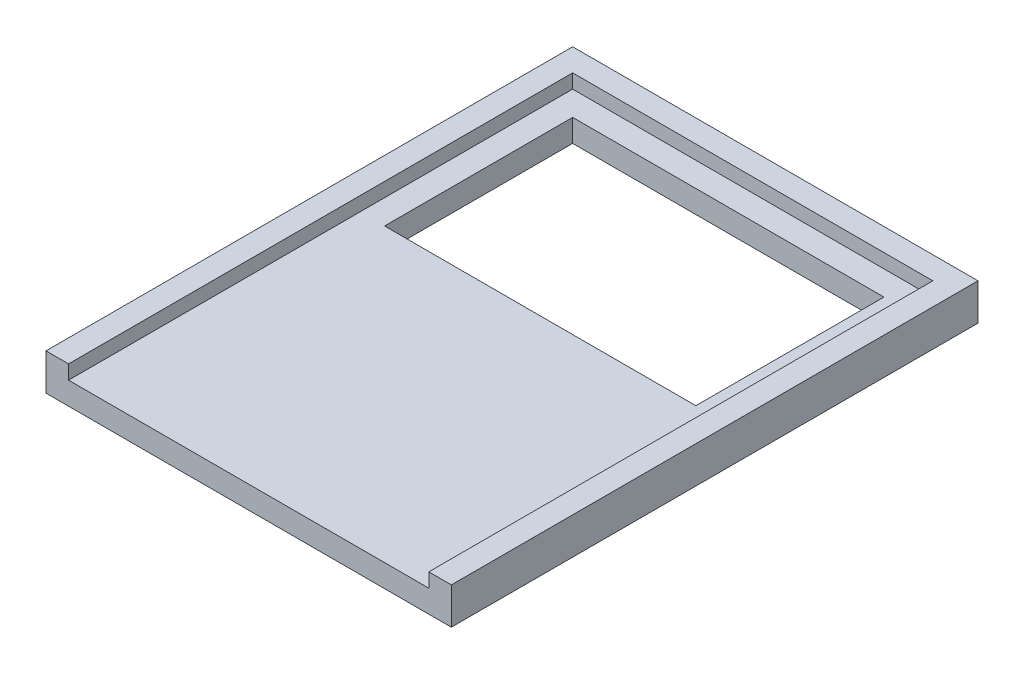
ISO-10303-21;
HEADER;
FILE_DESCRIPTION(('STEP AP214'),'2;1');
FILE_NAME('part.step','',(''),(''),'','','');
FILE_SCHEMA(('AUTOMOTIVE_DESIGN { 1 0 10303 214 1 1 1 1 }'));
ENDSEC;
DATA;
#1=APPLICATION_CONTEXT('core data for automotive mechanical design processes');
#2=APPLICATION_PROTOCOL_DEFINITION('international standard','automotive_design',2000,#1);
#3=PRODUCT_CONTEXT('',#1,'mechanical');
#4=PRODUCT('Part','Part','',(#3));
#5=PRODUCT_RELATED_PRODUCT_CATEGORY('part','',(#4));
#6=PRODUCT_DEFINITION_FORMATION('','',#4);
#7=PRODUCT_DEFINITION_CONTEXT('part definition',#1,'design');
#8=PRODUCT_DEFINITION('design','',#6,#7);
#9=PRODUCT_DEFINITION_SHAPE('','',#8);
#10=(LENGTH_UNIT() NAMED_UNIT(*) SI_UNIT(.MILLI.,.METRE.));
#11=(NAMED_UNIT(*) PLANE_ANGLE_UNIT() SI_UNIT($,.RADIAN.));
#12=(NAMED_UNIT(*) SI_UNIT($,.STERADIAN.) SOLID_ANGLE_UNIT());
#13=UNCERTAINTY_MEASURE_WITH_UNIT(LENGTH_MEASURE(1.E-05),#10,'distance_accuracy_value','');
#14=(GEOMETRIC_REPRESENTATION_CONTEXT(3) GLOBAL_UNCERTAINTY_ASSIGNED_CONTEXT((#13)) GLOBAL_UNIT_ASSIGNED_CONTEXT((#10,
#11,#12)) REPRESENTATION_CONTEXT('',''));
#15=CARTESIAN_POINT('',(0.,0.,0.));
#16=DIRECTION('',(0.,0.,1.));
#17=DIRECTION('',(1.,0.,0.));
#18=AXIS2_PLACEMENT_3D('',#15,#16,#17);
#19=CARTESIAN_POINT('',(0.,24.,0.));
#20=DIRECTION('',(0.,1.,0.));
#21=DIRECTION('',(0.,0.,1.));
#22=AXIS2_PLACEMENT_3D('',#19,#20,#21);
#23=PLANE('',#22);
#24=DIRECTION('',(0.,0.,1.));
#25=VECTOR('',#24,1.);
#26=CARTESIAN_POINT('',(191.5,24.,280.));
#27=LINE('',#26,#25);
#28=CARTESIAN_POINT('',(191.5,24.,-256.));
#29=VERTEX_POINT('',#28);
#30=CARTESIAN_POINT('',(191.5,24.,280.));
#31=VERTEX_POINT('',#30);
#32=EDGE_CURVE('E50',#29,#31,#27,.T.);
#33=ORIENTED_EDGE('',*,*,#32,.F.);
#34=DIRECTION('',(1.,0.,0.));
#35=VECTOR('',#34,1.);
#36=CARTESIAN_POINT('',(191.5,24.,-256.));
#37=LINE('',#36,#35);
#38=CARTESIAN_POINT('',(-191.5,24.,-256.));
#39=VERTEX_POINT('',#38);
#40=EDGE_CURVE('E144',#39,#29,#37,.T.);
#41=ORIENTED_EDGE('',*,*,#40,.F.);
#42=DIRECTION('',(0.,0.,-1.));
#43=VECTOR('',#42,1.);
#44=CARTESIAN_POINT('',(-191.5,24.,-256.));
#45=LINE('',#44,#43);
#46=CARTESIAN_POINT('',(-191.5,24.,280.));
#47=VERTEX_POINT('',#46);
#48=EDGE_CURVE('E160',#47,#39,#45,.T.);
#49=ORIENTED_EDGE('',*,*,#48,.F.);
#50=DIRECTION('',(1.,0.,0.));
#51=VECTOR('',#50,1.);
#52=CARTESIAN_POINT('',(-215.5,24.,280.));
#53=LINE('',#52,#51);
#54=EDGE_CURVE('E55',#47,#31,#53,.T.);
#55=ORIENTED_EDGE('',*,*,#54,.T.);
#56=EDGE_LOOP('',(#33,#41,#49,#55));
#57=FACE_BOUND('',#56,.T.);
#58=DIRECTION('',(1.,0.,0.));
#59=VECTOR('',#58,1.);
#60=CARTESIAN_POINT('',(-165.5,24.,-30.));
#61=LINE('',#60,#59);
#62=CARTESIAN_POINT('',(-165.5,24.,-30.));
#63=VERTEX_POINT('',#62);
#64=CARTESIAN_POINT('',(165.5,24.,-30.));
#65=VERTEX_POINT('',#64);
#66=EDGE_CURVE('E184',#63,#65,#61,.T.);
#67=ORIENTED_EDGE('',*,*,#66,.F.);
#68=DIRECTION('',(0.,0.,1.));
#69=VECTOR('',#68,1.);
#70=CARTESIAN_POINT('',(-165.5,24.,-230.));
#71=LINE('',#70,#69);
#72=CARTESIAN_POINT('',(-165.5,24.,-230.));
#73=VERTEX_POINT('',#72);
#74=EDGE_CURVE('E182',#73,#63,#71,.T.);
#75=ORIENTED_EDGE('',*,*,#74,.F.);
#76=DIRECTION('',(-1.,0.,0.));
#77=VECTOR('',#76,1.);
#78=CARTESIAN_POINT('',(-165.5,24.,-230.));
#79=LINE('',#78,#77);
#80=CARTESIAN_POINT('',(165.5,24.,-230.));
#81=VERTEX_POINT('',#80);
#82=EDGE_CURVE('E190',#81,#73,#79,.T.);
#83=ORIENTED_EDGE('',*,*,#82,.F.);
#84=DIRECTION('',(0.,0.,-1.));
#85=VECTOR('',#84,1.);
#86=CARTESIAN_POINT('',(165.5,24.,-230.));
#87=LINE('',#86,#85);
#88=EDGE_CURVE('E187',#65,#81,#87,.T.);
#89=ORIENTED_EDGE('',*,*,#88,.F.);
#90=EDGE_LOOP('',(#67,#75,#83,#89));
#91=FACE_BOUND('',#90,.T.);
#92=ADVANCED_FACE('F33',(#57,#91),#23,.T.);
#93=CARTESIAN_POINT('',(0.,0.,0.));
#94=DIRECTION('',(0.,1.,0.));
#95=DIRECTION('',(0.,0.,1.));
#96=AXIS2_PLACEMENT_3D('',#93,#94,#95);
#97=PLANE('',#96);
#98=DIRECTION('',(0.,0.,1.));
#99=VECTOR('',#98,1.);
#100=CARTESIAN_POINT('',(-215.5,0.,-280.));
#101=LINE('',#100,#99);
#102=CARTESIAN_POINT('',(-215.5,0.,-280.));
#103=VERTEX_POINT('',#102);
#104=CARTESIAN_POINT('',(-215.5,0.,280.));
#105=VERTEX_POINT('',#104);
#106=EDGE_CURVE('E127',#103,#105,#101,.T.);
#107=ORIENTED_EDGE('',*,*,#106,.F.);
#108=DIRECTION('',(-1.,0.,0.));
#109=VECTOR('',#108,1.);
#110=CARTESIAN_POINT('',(-215.5,0.,-280.));
#111=LINE('',#110,#109);
#112=CARTESIAN_POINT('',(215.5,0.,-280.));
#113=VERTEX_POINT('',#112);
#114=EDGE_CURVE('E218',#113,#103,#111,.T.);
#115=ORIENTED_EDGE('',*,*,#114,.F.);
#116=DIRECTION('',(0.,0.,-1.));
#117=VECTOR('',#116,1.);
#118=CARTESIAN_POINT('',(215.5,0.,-280.));
#119=LINE('',#118,#117);
#120=CARTESIAN_POINT('',(215.5,0.,280.));
#121=VERTEX_POINT('',#120);
#122=EDGE_CURVE('E235',#121,#113,#119,.T.);
#123=ORIENTED_EDGE('',*,*,#122,.F.);
#124=DIRECTION('',(1.,0.,0.));
#125=VECTOR('',#124,1.);
#126=CARTESIAN_POINT('',(-215.5,0.,280.));
#127=LINE('',#126,#125);
#128=EDGE_CURVE('E242',#105,#121,#127,.T.);
#129=ORIENTED_EDGE('',*,*,#128,.F.);
#130=EDGE_LOOP('',(#107,#115,#123,#129));
#131=FACE_BOUND('',#130,.T.);
#132=DIRECTION('',(0.,0.,1.));
#133=VECTOR('',#132,1.);
#134=CARTESIAN_POINT('',(-165.5,0.,-230.));
#135=LINE('',#134,#133);
#136=CARTESIAN_POINT('',(-165.5,0.,-230.));
#137=VERTEX_POINT('',#136);
#138=CARTESIAN_POINT('',(-165.5,0.,-30.));
#139=VERTEX_POINT('',#138);
#140=EDGE_CURVE('E180',#137,#139,#135,.T.);
#141=ORIENTED_EDGE('',*,*,#140,.T.);
#142=DIRECTION('',(1.,0.,0.));
#143=VECTOR('',#142,1.);
#144=CARTESIAN_POINT('',(-165.5,0.,-30.));
#145=LINE('',#144,#143);
#146=CARTESIAN_POINT('',(165.5,0.,-30.));
#147=VERTEX_POINT('',#146);
#148=EDGE_CURVE('E195',#139,#147,#145,.T.);
#149=ORIENTED_EDGE('',*,*,#148,.T.);
#150=DIRECTION('',(0.,0.,-1.));
#151=VECTOR('',#150,1.);
#152=CARTESIAN_POINT('',(165.5,0.,-230.));
#153=LINE('',#152,#151);
#154=CARTESIAN_POINT('',(165.5,0.,-230.));
#155=VERTEX_POINT('',#154);
#156=EDGE_CURVE('E198',#147,#155,#153,.T.);
#157=ORIENTED_EDGE('',*,*,#156,.T.);
#158=DIRECTION('',(-1.,0.,0.));
#159=VECTOR('',#158,1.);
#160=CARTESIAN_POINT('',(-165.5,0.,-230.));
#161=LINE('',#160,#159);
#162=EDGE_CURVE('E185',#155,#137,#161,.T.);
#163=ORIENTED_EDGE('',*,*,#162,.T.);
#164=EDGE_LOOP('',(#141,#149,#157,#163));
#165=FACE_BOUND('',#164,.T.);
#166=ADVANCED_FACE('F244',(#131,#165),#97,.F.);
#167=CARTESIAN_POINT('',(-215.5,24.,-280.));
#168=DIRECTION('',(1.,0.,0.));
#169=DIRECTION('',(0.,0.,-1.));
#170=AXIS2_PLACEMENT_3D('',#167,#168,#169);
#171=PLANE('',#170);
#172=ORIENTED_EDGE('',*,*,#106,.T.);
#173=DIRECTION('',(0.,-1.,0.));
#174=VECTOR('',#173,1.);
#175=CARTESIAN_POINT('',(-215.5,24.,280.));
#176=LINE('',#175,#174);
#177=CARTESIAN_POINT('',(-215.5,39.,280.));
#178=VERTEX_POINT('',#177);
#179=EDGE_CURVE('E11',#178,#105,#176,.T.);
#180=ORIENTED_EDGE('',*,*,#179,.F.);
#181=DIRECTION('',(0.,0.,1.));
#182=VECTOR('',#181,1.);
#183=CARTESIAN_POINT('',(-215.5,39.,280.));
#184=LINE('',#183,#182);
#185=CARTESIAN_POINT('',(-215.5,39.,-280.));
#186=VERTEX_POINT('',#185);
#187=EDGE_CURVE('E125',#186,#178,#184,.T.);
#188=ORIENTED_EDGE('',*,*,#187,.F.);
#189=DIRECTION('',(0.,-1.,0.));
#190=VECTOR('',#189,1.);
#191=CARTESIAN_POINT('',(-215.5,24.,-280.));
#192=LINE('',#191,#190);
#193=EDGE_CURVE('E217',#186,#103,#192,.T.);
#194=ORIENTED_EDGE('',*,*,#193,.T.);
#195=EDGE_LOOP('',(#172,#180,#188,#194));
#196=FACE_BOUND('',#195,.T.);
#197=ADVANCED_FACE('F35',(#196),#171,.F.);
#198=CARTESIAN_POINT('',(-215.5,24.,280.));
#199=DIRECTION('',(0.,0.,-1.));
#200=DIRECTION('',(-1.,0.,0.));
#201=AXIS2_PLACEMENT_3D('',#198,#199,#200);
#202=PLANE('',#201);
#203=ORIENTED_EDGE('',*,*,#128,.T.);
#204=DIRECTION('',(0.,-1.,0.));
#205=VECTOR('',#204,1.);
#206=CARTESIAN_POINT('',(215.5,24.,280.));
#207=LINE('',#206,#205);
#208=CARTESIAN_POINT('',(215.5,39.,280.));
#209=VERTEX_POINT('',#208);
#210=EDGE_CURVE('E42',#209,#121,#207,.T.);
#211=ORIENTED_EDGE('',*,*,#210,.F.);
#212=DIRECTION('',(1.,0.,0.));
#213=VECTOR('',#212,1.);
#214=CARTESIAN_POINT('',(215.5,39.,280.));
#215=LINE('',#214,#213);
#216=CARTESIAN_POINT('',(191.5,39.,280.));
#217=VERTEX_POINT('',#216);
#218=EDGE_CURVE('E152',#217,#209,#215,.T.);
#219=ORIENTED_EDGE('',*,*,#218,.F.);
#220=DIRECTION('',(0.,-1.,0.));
#221=VECTOR('',#220,1.);
#222=CARTESIAN_POINT('',(191.5,39.,280.));
#223=LINE('',#222,#221);
#224=EDGE_CURVE('E158',#217,#31,#223,.T.);
#225=ORIENTED_EDGE('',*,*,#224,.T.);
#226=ORIENTED_EDGE('',*,*,#54,.F.);
#227=DIRECTION('',(0.,-1.,0.));
#228=VECTOR('',#227,1.);
#229=CARTESIAN_POINT('',(-191.5,39.,280.));
#230=LINE('',#229,#228);
#231=CARTESIAN_POINT('',(-191.5,39.,280.));
#232=VERTEX_POINT('',#231);
#233=EDGE_CURVE('E133',#232,#47,#230,.T.);
#234=ORIENTED_EDGE('',*,*,#233,.F.);
#235=DIRECTION('',(1.,0.,0.));
#236=VECTOR('',#235,1.);
#237=CARTESIAN_POINT('',(-191.5,39.,280.));
#238=LINE('',#237,#236);
#239=EDGE_CURVE('E130',#178,#232,#238,.T.);
#240=ORIENTED_EDGE('',*,*,#239,.F.);
#241=ORIENTED_EDGE('',*,*,#179,.T.);
#242=EDGE_LOOP('',(#203,#211,#219,#225,#226,#234,#240,#241));
#243=FACE_BOUND('',#242,.T.);
#244=ADVANCED_FACE('F131',(#243),#202,.F.);
#245=CARTESIAN_POINT('',(215.5,24.,-280.));
#246=DIRECTION('',(-1.,0.,0.));
#247=DIRECTION('',(0.,0.,1.));
#248=AXIS2_PLACEMENT_3D('',#245,#246,#247);
#249=PLANE('',#248);
#250=ORIENTED_EDGE('',*,*,#122,.T.);
#251=DIRECTION('',(0.,-1.,0.));
#252=VECTOR('',#251,1.);
#253=CARTESIAN_POINT('',(215.5,24.,-280.));
#254=LINE('',#253,#252);
#255=CARTESIAN_POINT('',(215.5,39.,-280.));
#256=VERTEX_POINT('',#255);
#257=EDGE_CURVE('E234',#256,#113,#254,.T.);
#258=ORIENTED_EDGE('',*,*,#257,.F.);
#259=DIRECTION('',(0.,0.,-1.));
#260=VECTOR('',#259,1.);
#261=CARTESIAN_POINT('',(215.5,39.,-280.));
#262=LINE('',#261,#260);
#263=EDGE_CURVE('E155',#209,#256,#262,.T.);
#264=ORIENTED_EDGE('',*,*,#263,.F.);
#265=ORIENTED_EDGE('',*,*,#210,.T.);
#266=EDGE_LOOP('',(#250,#258,#264,#265));
#267=FACE_BOUND('',#266,.T.);
#268=ADVANCED_FACE('F231',(#267),#249,.F.);
#269=CARTESIAN_POINT('',(-215.5,24.,-280.));
#270=DIRECTION('',(0.,0.,1.));
#271=DIRECTION('',(1.,0.,0.));
#272=AXIS2_PLACEMENT_3D('',#269,#270,#271);
#273=PLANE('',#272);
#274=ORIENTED_EDGE('',*,*,#114,.T.);
#275=ORIENTED_EDGE('',*,*,#193,.F.);
#276=DIRECTION('',(-1.,0.,0.));
#277=VECTOR('',#276,1.);
#278=CARTESIAN_POINT('',(-215.5,39.,-280.));
#279=LINE('',#278,#277);
#280=EDGE_CURVE('E142',#256,#186,#279,.T.);
#281=ORIENTED_EDGE('',*,*,#280,.F.);
#282=ORIENTED_EDGE('',*,*,#257,.T.);
#283=EDGE_LOOP('',(#274,#275,#281,#282));
#284=FACE_BOUND('',#283,.T.);
#285=ADVANCED_FACE('F246',(#284),#273,.F.);
#286=CARTESIAN_POINT('',(-165.5,24.,-230.));
#287=DIRECTION('',(1.,0.,0.));
#288=DIRECTION('',(0.,0.,-1.));
#289=AXIS2_PLACEMENT_3D('',#286,#287,#288);
#290=PLANE('',#289);
#291=ORIENTED_EDGE('',*,*,#140,.F.);
#292=DIRECTION('',(0.,-1.,0.));
#293=VECTOR('',#292,1.);
#294=CARTESIAN_POINT('',(-165.5,24.,-230.));
#295=LINE('',#294,#293);
#296=EDGE_CURVE('E192',#73,#137,#295,.T.);
#297=ORIENTED_EDGE('',*,*,#296,.F.);
#298=ORIENTED_EDGE('',*,*,#74,.T.);
#299=DIRECTION('',(0.,-1.,0.));
#300=VECTOR('',#299,1.);
#301=CARTESIAN_POINT('',(-165.5,24.,-30.));
#302=LINE('',#301,#300);
#303=EDGE_CURVE('E209',#63,#139,#302,.T.);
#304=ORIENTED_EDGE('',*,*,#303,.T.);
#305=EDGE_LOOP('',(#291,#297,#298,#304));
#306=FACE_BOUND('',#305,.T.);
#307=ADVANCED_FACE('F248',(#306),#290,.T.);
#308=CARTESIAN_POINT('',(-165.5,24.,-30.));
#309=DIRECTION('',(0.,0.,-1.));
#310=DIRECTION('',(-1.,0.,0.));
#311=AXIS2_PLACEMENT_3D('',#308,#309,#310);
#312=PLANE('',#311);
#313=ORIENTED_EDGE('',*,*,#148,.F.);
#314=ORIENTED_EDGE('',*,*,#303,.F.);
#315=ORIENTED_EDGE('',*,*,#66,.T.);
#316=DIRECTION('',(0.,-1.,0.));
#317=VECTOR('',#316,1.);
#318=CARTESIAN_POINT('',(165.5,24.,-30.));
#319=LINE('',#318,#317);
#320=EDGE_CURVE('E207',#65,#147,#319,.T.);
#321=ORIENTED_EDGE('',*,*,#320,.T.);
#322=EDGE_LOOP('',(#313,#314,#315,#321));
#323=FACE_BOUND('',#322,.T.);
#324=ADVANCED_FACE('F254',(#323),#312,.T.);
#325=CARTESIAN_POINT('',(165.5,24.,-230.));
#326=DIRECTION('',(-1.,0.,0.));
#327=DIRECTION('',(0.,0.,1.));
#328=AXIS2_PLACEMENT_3D('',#325,#326,#327);
#329=PLANE('',#328);
#330=ORIENTED_EDGE('',*,*,#156,.F.);
#331=ORIENTED_EDGE('',*,*,#320,.F.);
#332=ORIENTED_EDGE('',*,*,#88,.T.);
#333=DIRECTION('',(0.,-1.,0.));
#334=VECTOR('',#333,1.);
#335=CARTESIAN_POINT('',(165.5,24.,-230.));
#336=LINE('',#335,#334);
#337=EDGE_CURVE('E205',#81,#155,#336,.T.);
#338=ORIENTED_EDGE('',*,*,#337,.T.);
#339=EDGE_LOOP('',(#330,#331,#332,#338));
#340=FACE_BOUND('',#339,.T.);
#341=ADVANCED_FACE('F267',(#340),#329,.T.);
#342=CARTESIAN_POINT('',(-165.5,24.,-230.));
#343=DIRECTION('',(0.,0.,1.));
#344=DIRECTION('',(1.,0.,0.));
#345=AXIS2_PLACEMENT_3D('',#342,#343,#344);
#346=PLANE('',#345);
#347=ORIENTED_EDGE('',*,*,#162,.F.);
#348=ORIENTED_EDGE('',*,*,#337,.F.);
#349=ORIENTED_EDGE('',*,*,#82,.T.);
#350=ORIENTED_EDGE('',*,*,#296,.T.);
#351=EDGE_LOOP('',(#347,#348,#349,#350));
#352=FACE_BOUND('',#351,.T.);
#353=ADVANCED_FACE('F271',(#352),#346,.T.);
#354=CARTESIAN_POINT('',(-191.5,39.,-256.));
#355=DIRECTION('',(-1.,0.,0.));
#356=DIRECTION('',(0.,0.,1.));
#357=AXIS2_PLACEMENT_3D('',#354,#355,#356);
#358=PLANE('',#357);
#359=ORIENTED_EDGE('',*,*,#48,.T.);
#360=DIRECTION('',(0.,-1.,0.));
#361=VECTOR('',#360,1.);
#362=CARTESIAN_POINT('',(-191.5,39.,-256.));
#363=LINE('',#362,#361);
#364=CARTESIAN_POINT('',(-191.5,39.,-256.));
#365=VERTEX_POINT('',#364);
#366=EDGE_CURVE('E172',#365,#39,#363,.T.);
#367=ORIENTED_EDGE('',*,*,#366,.F.);
#368=DIRECTION('',(0.,0.,-1.));
#369=VECTOR('',#368,1.);
#370=CARTESIAN_POINT('',(-191.5,39.,-256.));
#371=LINE('',#370,#369);
#372=EDGE_CURVE('E136',#232,#365,#371,.T.);
#373=ORIENTED_EDGE('',*,*,#372,.F.);
#374=ORIENTED_EDGE('',*,*,#233,.T.);
#375=EDGE_LOOP('',(#359,#367,#373,#374));
#376=FACE_BOUND('',#375,.T.);
#377=ADVANCED_FACE('F224',(#376),#358,.F.);
#378=CARTESIAN_POINT('',(191.5,39.,-256.));
#379=DIRECTION('',(0.,0.,-1.));
#380=DIRECTION('',(-1.,0.,0.));
#381=AXIS2_PLACEMENT_3D('',#378,#379,#380);
#382=PLANE('',#381);
#383=ORIENTED_EDGE('',*,*,#40,.T.);
#384=DIRECTION('',(0.,-1.,0.));
#385=VECTOR('',#384,1.);
#386=CARTESIAN_POINT('',(191.5,39.,-256.));
#387=LINE('',#386,#385);
#388=CARTESIAN_POINT('',(191.5,39.,-256.));
#389=VERTEX_POINT('',#388);
#390=EDGE_CURVE('E163',#389,#29,#387,.T.);
#391=ORIENTED_EDGE('',*,*,#390,.F.);
#392=DIRECTION('',(1.,0.,0.));
#393=VECTOR('',#392,1.);
#394=CARTESIAN_POINT('',(191.5,39.,-256.));
#395=LINE('',#394,#393);
#396=EDGE_CURVE('E148',#365,#389,#395,.T.);
#397=ORIENTED_EDGE('',*,*,#396,.F.);
#398=ORIENTED_EDGE('',*,*,#366,.T.);
#399=EDGE_LOOP('',(#383,#391,#397,#398));
#400=FACE_BOUND('',#399,.T.);
#401=ADVANCED_FACE('F226',(#400),#382,.F.);
#402=CARTESIAN_POINT('',(191.5,39.,280.));
#403=DIRECTION('',(1.,0.,0.));
#404=DIRECTION('',(0.,0.,-1.));
#405=AXIS2_PLACEMENT_3D('',#402,#403,#404);
#406=PLANE('',#405);
#407=ORIENTED_EDGE('',*,*,#32,.T.);
#408=ORIENTED_EDGE('',*,*,#224,.F.);
#409=DIRECTION('',(0.,0.,1.));
#410=VECTOR('',#409,1.);
#411=CARTESIAN_POINT('',(191.5,39.,280.));
#412=LINE('',#411,#410);
#413=EDGE_CURVE('E150',#389,#217,#412,.T.);
#414=ORIENTED_EDGE('',*,*,#413,.F.);
#415=ORIENTED_EDGE('',*,*,#390,.T.);
#416=EDGE_LOOP('',(#407,#408,#414,#415));
#417=FACE_BOUND('',#416,.T.);
#418=ADVANCED_FACE('F227',(#417),#406,.F.);
#419=CARTESIAN_POINT('',(0.,39.,0.));
#420=DIRECTION('',(0.,-1.,0.));
#421=DIRECTION('',(0.,0.,-1.));
#422=AXIS2_PLACEMENT_3D('',#419,#420,#421);
#423=PLANE('',#422);
#424=ORIENTED_EDGE('',*,*,#187,.T.);
#425=ORIENTED_EDGE('',*,*,#239,.T.);
#426=ORIENTED_EDGE('',*,*,#372,.T.);
#427=ORIENTED_EDGE('',*,*,#396,.T.);
#428=ORIENTED_EDGE('',*,*,#413,.T.);
#429=ORIENTED_EDGE('',*,*,#218,.T.);
#430=ORIENTED_EDGE('',*,*,#263,.T.);
#431=ORIENTED_EDGE('',*,*,#280,.T.);
#432=EDGE_LOOP('',(#424,#425,#426,#427,#428,#429,#430,#431));
#433=FACE_BOUND('',#432,.T.);
#434=ADVANCED_FACE('F139',(#433),#423,.F.);
#435=CLOSED_SHELL('',(#92,#166,#197,#244,#268,#285,#307,#324,#341,#353,#377,#401,#418,#434));
#436=MANIFOLD_SOLID_BREP('B2',#435);
#437=ADVANCED_BREP_SHAPE_REPRESENTATION('',(#18,#436),#14);
#438=SHAPE_DEFINITION_REPRESENTATION(#9,#437);
ENDSEC;
END-ISO-10303-21;
